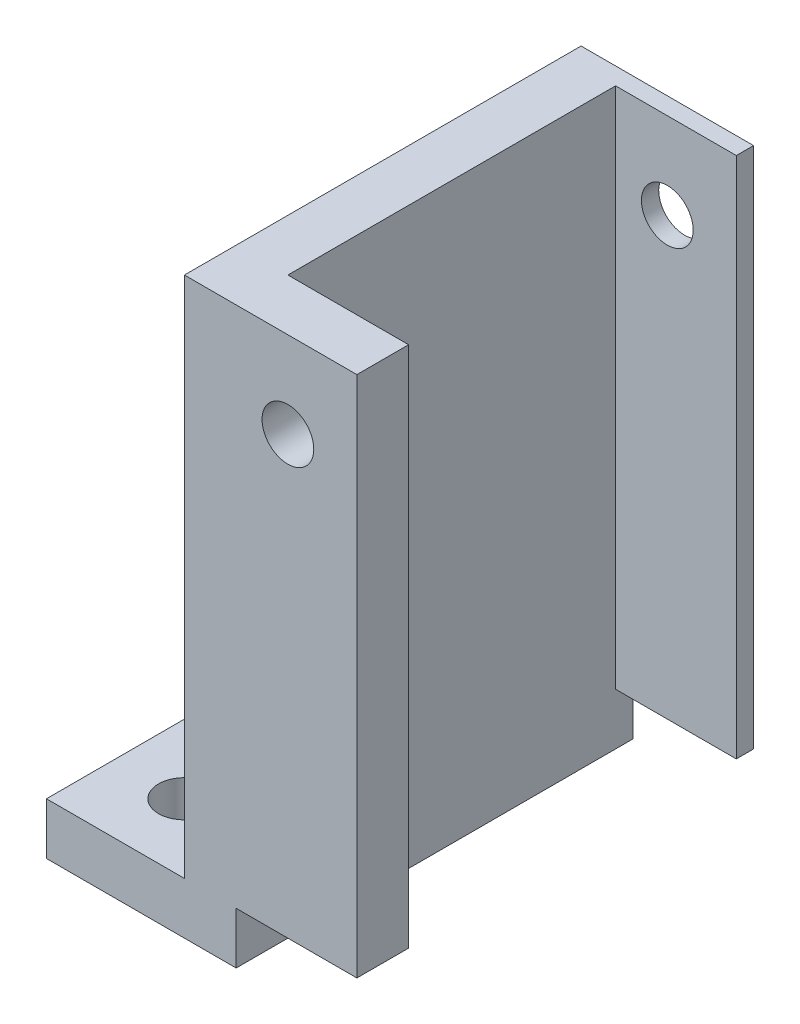
ISO-10303-21;
HEADER;
FILE_DESCRIPTION(('STEP AP214'),'2;1');
FILE_NAME('part.step','',(''),(''),'','','');
FILE_SCHEMA(('AUTOMOTIVE_DESIGN { 1 0 10303 214 1 1 1 1 }'));
ENDSEC;
DATA;
#1=APPLICATION_CONTEXT('core data for automotive mechanical design processes');
#2=APPLICATION_PROTOCOL_DEFINITION('international standard','automotive_design',2000,#1);
#3=PRODUCT_CONTEXT('',#1,'mechanical');
#4=PRODUCT('Part','Part','',(#3));
#5=PRODUCT_RELATED_PRODUCT_CATEGORY('part','',(#4));
#6=PRODUCT_DEFINITION_FORMATION('','',#4);
#7=PRODUCT_DEFINITION_CONTEXT('part definition',#1,'design');
#8=PRODUCT_DEFINITION('design','',#6,#7);
#9=PRODUCT_DEFINITION_SHAPE('','',#8);
#10=(LENGTH_UNIT() NAMED_UNIT(*) SI_UNIT(.MILLI.,.METRE.));
#11=(NAMED_UNIT(*) PLANE_ANGLE_UNIT() SI_UNIT($,.RADIAN.));
#12=(NAMED_UNIT(*) SI_UNIT($,.STERADIAN.) SOLID_ANGLE_UNIT());
#13=UNCERTAINTY_MEASURE_WITH_UNIT(LENGTH_MEASURE(1.E-05),#10,'distance_accuracy_value','');
#14=(GEOMETRIC_REPRESENTATION_CONTEXT(3) GLOBAL_UNCERTAINTY_ASSIGNED_CONTEXT((#13)) GLOBAL_UNIT_ASSIGNED_CONTEXT((#10,
#11,#12)) REPRESENTATION_CONTEXT('',''));
#15=CARTESIAN_POINT('',(0.,0.,0.));
#16=DIRECTION('',(0.,0.,1.));
#17=DIRECTION('',(1.,0.,0.));
#18=AXIS2_PLACEMENT_3D('',#15,#16,#17);
#19=CARTESIAN_POINT('',(10.,-30.3,23.));
#20=DIRECTION('',(0.,1.,0.));
#21=DIRECTION('',(0.,0.,1.));
#22=AXIS2_PLACEMENT_3D('',#19,#20,#21);
#23=PLANE('',#22);
#24=DIRECTION('',(0.,0.,1.));
#25=VECTOR('',#24,1.);
#26=CARTESIAN_POINT('',(3.,-30.3,23.));
#27=LINE('',#26,#25);
#28=CARTESIAN_POINT('',(3.,-30.3,0.));
#29=VERTEX_POINT('',#28);
#30=CARTESIAN_POINT('',(3.,-30.3,1.));
#31=VERTEX_POINT('',#30);
#32=EDGE_CURVE('E56',#29,#31,#27,.T.);
#33=ORIENTED_EDGE('',*,*,#32,.F.);
#34=DIRECTION('',(-1.,0.,0.));
#35=VECTOR('',#34,1.);
#36=CARTESIAN_POINT('',(10.,-30.3,0.));
#37=LINE('',#36,#35);
#38=CARTESIAN_POINT('',(10.,-30.3,0.));
#39=VERTEX_POINT('',#38);
#40=EDGE_CURVE('E225',#39,#29,#37,.T.);
#41=ORIENTED_EDGE('',*,*,#40,.F.);
#42=DIRECTION('',(0.,0.,-1.));
#43=VECTOR('',#42,1.);
#44=CARTESIAN_POINT('',(10.,-30.3,23.));
#45=LINE('',#44,#43);
#46=CARTESIAN_POINT('',(10.,-30.3,1.));
#47=VERTEX_POINT('',#46);
#48=EDGE_CURVE('E210',#47,#39,#45,.T.);
#49=ORIENTED_EDGE('',*,*,#48,.F.);
#50=DIRECTION('',(-1.,0.,0.));
#51=VECTOR('',#50,1.);
#52=CARTESIAN_POINT('',(10.,-30.3,1.));
#53=LINE('',#52,#51);
#54=EDGE_CURVE('E279',#47,#31,#53,.T.);
#55=ORIENTED_EDGE('',*,*,#54,.T.);
#56=EDGE_LOOP('',(#33,#41,#49,#55));
#57=FACE_BOUND('',#56,.T.);
#58=ADVANCED_FACE('F33',(#57),#23,.F.);
#59=CARTESIAN_POINT('',(3.,-30.3,20.));
#60=VERTEX_POINT('',#59);
#61=CARTESIAN_POINT('',(3.,-30.3,23.));
#62=VERTEX_POINT('',#61);
#63=EDGE_CURVE('E146',#60,#62,#27,.T.);
#64=ORIENTED_EDGE('',*,*,#63,.F.);
#65=DIRECTION('',(1.,0.,0.));
#66=VECTOR('',#65,1.);
#67=CARTESIAN_POINT('',(10.,-30.3,20.));
#68=LINE('',#67,#66);
#69=CARTESIAN_POINT('',(10.,-30.3,20.));
#70=VERTEX_POINT('',#69);
#71=EDGE_CURVE('E206',#60,#70,#68,.T.);
#72=ORIENTED_EDGE('',*,*,#71,.T.);
#73=CARTESIAN_POINT('',(10.,-30.3,23.));
#74=VERTEX_POINT('',#73);
#75=EDGE_CURVE('E211',#74,#70,#45,.T.);
#76=ORIENTED_EDGE('',*,*,#75,.F.);
#77=DIRECTION('',(-1.,0.,0.));
#78=VECTOR('',#77,1.);
#79=CARTESIAN_POINT('',(10.,-30.3,23.));
#80=LINE('',#79,#78);
#81=EDGE_CURVE('E234',#74,#62,#80,.T.);
#82=ORIENTED_EDGE('',*,*,#81,.T.);
#83=EDGE_LOOP('',(#64,#72,#76,#82));
#84=FACE_BOUND('',#83,.T.);
#85=ADVANCED_FACE('F292',(#84),#23,.F.);
#86=CARTESIAN_POINT('',(10.,0.,0.));
#87=DIRECTION('',(1.,0.,0.));
#88=DIRECTION('',(0.,0.,-1.));
#89=AXIS2_PLACEMENT_3D('',#86,#87,#88);
#90=PLANE('',#89);
#91=DIRECTION('',(0.,1.,0.));
#92=VECTOR('',#91,1.);
#93=CARTESIAN_POINT('',(10.,-30.3,20.));
#94=LINE('',#93,#92);
#95=CARTESIAN_POINT('',(10.,0.,20.));
#96=VERTEX_POINT('',#95);
#97=EDGE_CURVE('E186',#70,#96,#94,.T.);
#98=ORIENTED_EDGE('',*,*,#97,.T.);
#99=DIRECTION('',(0.,0.,1.));
#100=VECTOR('',#99,1.);
#101=CARTESIAN_POINT('',(10.,0.,23.));
#102=LINE('',#101,#100);
#103=CARTESIAN_POINT('',(10.,0.,23.));
#104=VERTEX_POINT('',#103);
#105=EDGE_CURVE('E213',#96,#104,#102,.T.);
#106=ORIENTED_EDGE('',*,*,#105,.T.);
#107=DIRECTION('',(0.,-1.,0.));
#108=VECTOR('',#107,1.);
#109=CARTESIAN_POINT('',(10.,0.,23.));
#110=LINE('',#109,#108);
#111=EDGE_CURVE('E207',#104,#74,#110,.T.);
#112=ORIENTED_EDGE('',*,*,#111,.T.);
#113=ORIENTED_EDGE('',*,*,#75,.T.);
#114=EDGE_LOOP('',(#98,#106,#112,#113));
#115=FACE_BOUND('',#114,.T.);
#116=ADVANCED_FACE('F295',(#115),#90,.T.);
#117=CARTESIAN_POINT('',(10.,0.,23.));
#118=DIRECTION('',(0.,0.,-1.));
#119=DIRECTION('',(0.,1.,0.));
#120=AXIS2_PLACEMENT_3D('',#117,#118,#119);
#121=PLANE('',#120);
#122=CARTESIAN_POINT('',(6.,-5.,23.));
#123=DIRECTION('',(0.,0.,1.));
#124=DIRECTION('',(1.,0.,0.));
#125=AXIS2_PLACEMENT_3D('',#122,#123,#124);
#126=CIRCLE('',#125,1.5);
#127=CARTESIAN_POINT('',(7.5,-5.,23.));
#128=VERTEX_POINT('',#127);
#129=EDGE_CURVE('E348',#128,#128,#126,.T.);
#130=ORIENTED_EDGE('',*,*,#129,.F.);
#131=EDGE_LOOP('',(#130));
#132=FACE_BOUND('',#131,.T.);
#133=DIRECTION('',(0.,-1.,0.));
#134=VECTOR('',#133,1.);
#135=CARTESIAN_POINT('',(0.,0.,23.));
#136=LINE('',#135,#134);
#137=CARTESIAN_POINT('',(0.,0.,23.));
#138=VERTEX_POINT('',#137);
#139=CARTESIAN_POINT('',(0.,-30.3,23.));
#140=VERTEX_POINT('',#139);
#141=EDGE_CURVE('E165',#138,#140,#136,.T.);
#142=ORIENTED_EDGE('',*,*,#141,.T.);
#143=DIRECTION('',(-1.,0.,0.));
#144=VECTOR('',#143,1.);
#145=CARTESIAN_POINT('',(3.,-30.3,23.));
#146=LINE('',#145,#144);
#147=CARTESIAN_POINT('',(-8.,-30.3,23.));
#148=VERTEX_POINT('',#147);
#149=EDGE_CURVE('E251',#140,#148,#146,.T.);
#150=ORIENTED_EDGE('',*,*,#149,.T.);
#151=DIRECTION('',(0.,1.,0.));
#152=VECTOR('',#151,1.);
#153=CARTESIAN_POINT('',(-8.,-33.3,23.));
#154=LINE('',#153,#152);
#155=CARTESIAN_POINT('',(-8.,-33.3,23.));
#156=VERTEX_POINT('',#155);
#157=EDGE_CURVE('E253',#156,#148,#154,.T.);
#158=ORIENTED_EDGE('',*,*,#157,.F.);
#159=DIRECTION('',(-1.,0.,0.));
#160=VECTOR('',#159,1.);
#161=CARTESIAN_POINT('',(3.,-33.3,23.));
#162=LINE('',#161,#160);
#163=CARTESIAN_POINT('',(3.,-33.3,23.));
#164=VERTEX_POINT('',#163);
#165=EDGE_CURVE('E373',#164,#156,#162,.T.);
#166=ORIENTED_EDGE('',*,*,#165,.F.);
#167=DIRECTION('',(0.,1.,0.));
#168=VECTOR('',#167,1.);
#169=CARTESIAN_POINT('',(3.,-33.3,23.));
#170=LINE('',#169,#168);
#171=EDGE_CURVE('E238',#164,#62,#170,.T.);
#172=ORIENTED_EDGE('',*,*,#171,.T.);
#173=ORIENTED_EDGE('',*,*,#81,.F.);
#174=ORIENTED_EDGE('',*,*,#111,.F.);
#175=DIRECTION('',(-1.,0.,0.));
#176=VECTOR('',#175,1.);
#177=CARTESIAN_POINT('',(10.,0.,23.));
#178=LINE('',#177,#176);
#179=EDGE_CURVE('E219',#104,#138,#178,.T.);
#180=ORIENTED_EDGE('',*,*,#179,.T.);
#181=EDGE_LOOP('',(#142,#150,#158,#166,#172,#173,#174,#180));
#182=FACE_BOUND('',#181,.T.);
#183=ADVANCED_FACE('F35',(#132,#182),#121,.F.);
#184=CARTESIAN_POINT('',(10.,0.,0.));
#185=DIRECTION('',(0.,0.,1.));
#186=DIRECTION('',(0.,-1.,0.));
#187=AXIS2_PLACEMENT_3D('',#184,#185,#186);
#188=PLANE('',#187);
#189=CARTESIAN_POINT('',(6.,-5.,0.));
#190=DIRECTION('',(0.,0.,1.));
#191=DIRECTION('',(0.,-1.,0.));
#192=AXIS2_PLACEMENT_3D('',#189,#190,#191);
#193=CIRCLE('',#192,1.5);
#194=CARTESIAN_POINT('',(6.,-6.5,0.));
#195=VERTEX_POINT('',#194);
#196=EDGE_CURVE('E358',#195,#195,#193,.T.);
#197=ORIENTED_EDGE('',*,*,#196,.T.);
#198=EDGE_LOOP('',(#197));
#199=FACE_BOUND('',#198,.T.);
#200=DIRECTION('',(0.,1.,0.));
#201=VECTOR('',#200,1.);
#202=CARTESIAN_POINT('',(0.,0.,0.));
#203=LINE('',#202,#201);
#204=CARTESIAN_POINT('',(0.,-30.3,0.));
#205=VERTEX_POINT('',#204);
#206=CARTESIAN_POINT('',(0.,0.,0.));
#207=VERTEX_POINT('',#206);
#208=EDGE_CURVE('E179',#205,#207,#203,.T.);
#209=ORIENTED_EDGE('',*,*,#208,.T.);
#210=DIRECTION('',(-1.,0.,0.));
#211=VECTOR('',#210,1.);
#212=CARTESIAN_POINT('',(10.,0.,0.));
#213=LINE('',#212,#211);
#214=CARTESIAN_POINT('',(10.,0.,0.));
#215=VERTEX_POINT('',#214);
#216=EDGE_CURVE('E222',#215,#207,#213,.T.);
#217=ORIENTED_EDGE('',*,*,#216,.F.);
#218=DIRECTION('',(0.,1.,0.));
#219=VECTOR('',#218,1.);
#220=CARTESIAN_POINT('',(10.,0.,0.));
#221=LINE('',#220,#219);
#222=EDGE_CURVE('E212',#39,#215,#221,.T.);
#223=ORIENTED_EDGE('',*,*,#222,.F.);
#224=ORIENTED_EDGE('',*,*,#40,.T.);
#225=DIRECTION('',(0.,1.,0.));
#226=VECTOR('',#225,1.);
#227=CARTESIAN_POINT('',(3.,-33.3,0.));
#228=LINE('',#227,#226);
#229=CARTESIAN_POINT('',(3.,-33.3,0.));
#230=VERTEX_POINT('',#229);
#231=EDGE_CURVE('E265',#230,#29,#228,.T.);
#232=ORIENTED_EDGE('',*,*,#231,.F.);
#233=DIRECTION('',(1.,0.,0.));
#234=VECTOR('',#233,1.);
#235=CARTESIAN_POINT('',(3.,-33.3,0.));
#236=LINE('',#235,#234);
#237=CARTESIAN_POINT('',(-8.,-33.3,0.));
#238=VERTEX_POINT('',#237);
#239=EDGE_CURVE('E243',#238,#230,#236,.T.);
#240=ORIENTED_EDGE('',*,*,#239,.F.);
#241=DIRECTION('',(0.,1.,0.));
#242=VECTOR('',#241,1.);
#243=CARTESIAN_POINT('',(-8.,-33.3,0.));
#244=LINE('',#243,#242);
#245=CARTESIAN_POINT('',(-8.,-30.3,0.));
#246=VERTEX_POINT('',#245);
#247=EDGE_CURVE('E263',#238,#246,#244,.T.);
#248=ORIENTED_EDGE('',*,*,#247,.T.);
#249=DIRECTION('',(1.,0.,0.));
#250=VECTOR('',#249,1.);
#251=CARTESIAN_POINT('',(3.,-30.3,0.));
#252=LINE('',#251,#250);
#253=EDGE_CURVE('E255',#246,#205,#252,.T.);
#254=ORIENTED_EDGE('',*,*,#253,.T.);
#255=EDGE_LOOP('',(#209,#217,#223,#224,#232,#240,#248,#254));
#256=FACE_BOUND('',#255,.T.);
#257=ADVANCED_FACE('F315',(#199,#256),#188,.F.);
#258=CARTESIAN_POINT('',(10.,0.,23.));
#259=DIRECTION('',(0.,-1.,0.));
#260=DIRECTION('',(0.,0.,-1.));
#261=AXIS2_PLACEMENT_3D('',#258,#259,#260);
#262=PLANE('',#261);
#263=ORIENTED_EDGE('',*,*,#105,.F.);
#264=DIRECTION('',(1.,0.,0.));
#265=VECTOR('',#264,1.);
#266=CARTESIAN_POINT('',(10.,0.,20.));
#267=LINE('',#266,#265);
#268=CARTESIAN_POINT('',(3.,0.,20.));
#269=VERTEX_POINT('',#268);
#270=EDGE_CURVE('E202',#269,#96,#267,.T.);
#271=ORIENTED_EDGE('',*,*,#270,.F.);
#272=DIRECTION('',(0.,0.,1.));
#273=VECTOR('',#272,1.);
#274=CARTESIAN_POINT('',(3.,0.,1.));
#275=LINE('',#274,#273);
#276=CARTESIAN_POINT('',(3.,0.,1.));
#277=VERTEX_POINT('',#276);
#278=EDGE_CURVE('E303',#277,#269,#275,.T.);
#279=ORIENTED_EDGE('',*,*,#278,.F.);
#280=DIRECTION('',(-1.,0.,0.));
#281=VECTOR('',#280,1.);
#282=CARTESIAN_POINT('',(10.,0.,1.));
#283=LINE('',#282,#281);
#284=CARTESIAN_POINT('',(10.,0.,1.));
#285=VERTEX_POINT('',#284);
#286=EDGE_CURVE('E307',#285,#277,#283,.T.);
#287=ORIENTED_EDGE('',*,*,#286,.F.);
#288=EDGE_CURVE('E171',#215,#285,#102,.T.);
#289=ORIENTED_EDGE('',*,*,#288,.F.);
#290=ORIENTED_EDGE('',*,*,#216,.T.);
#291=DIRECTION('',(0.,0.,1.));
#292=VECTOR('',#291,1.);
#293=CARTESIAN_POINT('',(0.,0.,23.));
#294=LINE('',#293,#292);
#295=EDGE_CURVE('E173',#207,#138,#294,.T.);
#296=ORIENTED_EDGE('',*,*,#295,.T.);
#297=ORIENTED_EDGE('',*,*,#179,.F.);
#298=EDGE_LOOP('',(#263,#271,#279,#287,#289,#290,#296,#297));
#299=FACE_BOUND('',#298,.T.);
#300=ADVANCED_FACE('F312',(#299),#262,.F.);
#301=DIRECTION('',(0.,1.,0.));
#302=VECTOR('',#301,1.);
#303=CARTESIAN_POINT('',(10.,-30.3,1.));
#304=LINE('',#303,#302);
#305=EDGE_CURVE('E204',#47,#285,#304,.T.);
#306=ORIENTED_EDGE('',*,*,#305,.F.);
#307=ORIENTED_EDGE('',*,*,#48,.T.);
#308=ORIENTED_EDGE('',*,*,#222,.T.);
#309=ORIENTED_EDGE('',*,*,#288,.T.);
#310=EDGE_LOOP('',(#306,#307,#308,#309));
#311=FACE_BOUND('',#310,.T.);
#312=ADVANCED_FACE('F314',(#311),#90,.T.);
#313=CARTESIAN_POINT('',(0.,0.,0.));
#314=DIRECTION('',(1.,0.,0.));
#315=DIRECTION('',(0.,0.,-1.));
#316=AXIS2_PLACEMENT_3D('',#313,#314,#315);
#317=PLANE('',#316);
#318=DIRECTION('',(0.,0.,-1.));
#319=VECTOR('',#318,1.);
#320=CARTESIAN_POINT('',(0.,-25.3502525316942,0.));
#321=LINE('',#320,#319);
#322=CARTESIAN_POINT('',(0.,-25.3502525316942,8.));
#323=VERTEX_POINT('',#322);
#324=CARTESIAN_POINT('',(0.,-25.3502525316942,15.));
#325=VERTEX_POINT('',#324);
#326=EDGE_CURVE('E153',#323,#325,#321,.F.);
#327=ORIENTED_EDGE('',*,*,#326,.T.);
#328=DIRECTION('',(0.,-1.,0.));
#329=VECTOR('',#328,1.);
#330=CARTESIAN_POINT('',(0.,0.,15.));
#331=LINE('',#330,#329);
#332=CARTESIAN_POINT('',(-2.30327909522821E-12,-30.3,15.));
#333=VERTEX_POINT('',#332);
#334=EDGE_CURVE('E347',#325,#333,#331,.T.);
#335=ORIENTED_EDGE('',*,*,#334,.T.);
#336=DIRECTION('',(0.,0.,-1.));
#337=VECTOR('',#336,1.);
#338=CARTESIAN_POINT('',(0.,-30.3,23.));
#339=LINE('',#338,#337);
#340=EDGE_CURVE('E164',#140,#333,#339,.T.);
#341=ORIENTED_EDGE('',*,*,#340,.F.);
#342=ORIENTED_EDGE('',*,*,#141,.F.);
#343=ORIENTED_EDGE('',*,*,#295,.F.);
#344=ORIENTED_EDGE('',*,*,#208,.F.);
#345=CARTESIAN_POINT('',(0.,-30.3,8.));
#346=VERTEX_POINT('',#345);
#347=EDGE_CURVE('E161',#346,#205,#339,.T.);
#348=ORIENTED_EDGE('',*,*,#347,.F.);
#349=DIRECTION('',(0.,-1.,0.));
#350=VECTOR('',#349,1.);
#351=CARTESIAN_POINT('',(0.,0.,8.));
#352=LINE('',#351,#350);
#353=EDGE_CURVE('E48',#323,#346,#352,.T.);
#354=ORIENTED_EDGE('',*,*,#353,.F.);
#355=EDGE_LOOP('',(#327,#335,#341,#342,#343,#344,#348,#354));
#356=FACE_BOUND('',#355,.T.);
#357=ADVANCED_FACE('F321',(#356),#317,.F.);
#358=CARTESIAN_POINT('',(10.,-30.3,20.));
#359=DIRECTION('',(0.,0.,1.));
#360=DIRECTION('',(1.,0.,0.));
#361=AXIS2_PLACEMENT_3D('',#358,#359,#360);
#362=PLANE('',#361);
#363=CARTESIAN_POINT('',(6.,-5.,20.));
#364=DIRECTION('',(0.,0.,1.));
#365=DIRECTION('',(1.,0.,0.));
#366=AXIS2_PLACEMENT_3D('',#363,#364,#365);
#367=CIRCLE('',#366,1.5);
#368=CARTESIAN_POINT('',(7.5,-5.,20.));
#369=VERTEX_POINT('',#368);
#370=EDGE_CURVE('E355',#369,#369,#367,.T.);
#371=ORIENTED_EDGE('',*,*,#370,.T.);
#372=EDGE_LOOP('',(#371));
#373=FACE_BOUND('',#372,.T.);
#374=ORIENTED_EDGE('',*,*,#270,.T.);
#375=ORIENTED_EDGE('',*,*,#97,.F.);
#376=ORIENTED_EDGE('',*,*,#71,.F.);
#377=DIRECTION('',(0.,1.,0.));
#378=VECTOR('',#377,1.);
#379=CARTESIAN_POINT('',(3.,-30.3,20.));
#380=LINE('',#379,#378);
#381=EDGE_CURVE('E193',#60,#269,#380,.T.);
#382=ORIENTED_EDGE('',*,*,#381,.T.);
#383=EDGE_LOOP('',(#374,#375,#376,#382));
#384=FACE_BOUND('',#383,.T.);
#385=ADVANCED_FACE('F305',(#373,#384),#362,.F.);
#386=CARTESIAN_POINT('',(3.,-30.3,1.));
#387=DIRECTION('',(-1.,0.,0.));
#388=DIRECTION('',(0.,0.,1.));
#389=AXIS2_PLACEMENT_3D('',#386,#387,#388);
#390=PLANE('',#389);
#391=ORIENTED_EDGE('',*,*,#171,.F.);
#392=DIRECTION('',(0.,0.,1.));
#393=VECTOR('',#392,1.);
#394=CARTESIAN_POINT('',(3.,-33.3,23.));
#395=LINE('',#394,#393);
#396=EDGE_CURVE('E259',#230,#164,#395,.T.);
#397=ORIENTED_EDGE('',*,*,#396,.F.);
#398=ORIENTED_EDGE('',*,*,#231,.T.);
#399=ORIENTED_EDGE('',*,*,#32,.T.);
#400=DIRECTION('',(0.,1.,0.));
#401=VECTOR('',#400,1.);
#402=CARTESIAN_POINT('',(3.,-30.3,1.));
#403=LINE('',#402,#401);
#404=EDGE_CURVE('E198',#31,#277,#403,.T.);
#405=ORIENTED_EDGE('',*,*,#404,.T.);
#406=ORIENTED_EDGE('',*,*,#278,.T.);
#407=ORIENTED_EDGE('',*,*,#381,.F.);
#408=ORIENTED_EDGE('',*,*,#63,.T.);
#409=EDGE_LOOP('',(#391,#397,#398,#399,#405,#406,#407,#408));
#410=FACE_BOUND('',#409,.T.);
#411=ADVANCED_FACE('F300',(#410),#390,.F.);
#412=CARTESIAN_POINT('',(10.,-30.3,1.));
#413=DIRECTION('',(0.,0.,-1.));
#414=DIRECTION('',(-1.,0.,0.));
#415=AXIS2_PLACEMENT_3D('',#412,#413,#414);
#416=PLANE('',#415);
#417=CARTESIAN_POINT('',(6.,-5.,1.));
#418=DIRECTION('',(0.,0.,-1.));
#419=DIRECTION('',(-1.,0.,0.));
#420=AXIS2_PLACEMENT_3D('',#417,#418,#419);
#421=CIRCLE('',#420,1.5);
#422=CARTESIAN_POINT('',(4.5,-5.,1.));
#423=VERTEX_POINT('',#422);
#424=EDGE_CURVE('E166',#423,#423,#421,.T.);
#425=ORIENTED_EDGE('',*,*,#424,.T.);
#426=EDGE_LOOP('',(#425));
#427=FACE_BOUND('',#426,.T.);
#428=ORIENTED_EDGE('',*,*,#286,.T.);
#429=ORIENTED_EDGE('',*,*,#404,.F.);
#430=ORIENTED_EDGE('',*,*,#54,.F.);
#431=ORIENTED_EDGE('',*,*,#305,.T.);
#432=EDGE_LOOP('',(#428,#429,#430,#431));
#433=FACE_BOUND('',#432,.T.);
#434=ADVANCED_FACE('F311',(#427,#433),#416,.F.);
#435=CARTESIAN_POINT('',(-8.,-33.3,23.));
#436=DIRECTION('',(1.,0.,0.));
#437=DIRECTION('',(0.,0.,-1.));
#438=AXIS2_PLACEMENT_3D('',#435,#436,#437);
#439=PLANE('',#438);
#440=DIRECTION('',(0.,0.,-1.));
#441=VECTOR('',#440,1.);
#442=CARTESIAN_POINT('',(-8.,-30.3,23.));
#443=LINE('',#442,#441);
#444=EDGE_CURVE('E260',#148,#246,#443,.T.);
#445=ORIENTED_EDGE('',*,*,#444,.T.);
#446=ORIENTED_EDGE('',*,*,#247,.F.);
#447=DIRECTION('',(0.,0.,-1.));
#448=VECTOR('',#447,1.);
#449=CARTESIAN_POINT('',(-8.,-33.3,23.));
#450=LINE('',#449,#448);
#451=EDGE_CURVE('E275',#156,#238,#450,.T.);
#452=ORIENTED_EDGE('',*,*,#451,.F.);
#453=ORIENTED_EDGE('',*,*,#157,.T.);
#454=EDGE_LOOP('',(#445,#446,#452,#453));
#455=FACE_BOUND('',#454,.T.);
#456=ADVANCED_FACE('F380',(#455),#439,.F.);
#457=CARTESIAN_POINT('',(0.,-33.3,0.));
#458=DIRECTION('',(0.,1.,0.));
#459=DIRECTION('',(0.,0.,1.));
#460=AXIS2_PLACEMENT_3D('',#457,#458,#459);
#461=PLANE('',#460);
#462=ORIENTED_EDGE('',*,*,#396,.T.);
#463=ORIENTED_EDGE('',*,*,#165,.T.);
#464=ORIENTED_EDGE('',*,*,#451,.T.);
#465=ORIENTED_EDGE('',*,*,#239,.T.);
#466=EDGE_LOOP('',(#462,#463,#464,#465));
#467=FACE_BOUND('',#466,.T.);
#468=CARTESIAN_POINT('',(-4.,-33.3,19.));
#469=DIRECTION('',(0.,1.,0.));
#470=DIRECTION('',(0.,0.,1.));
#471=AXIS2_PLACEMENT_3D('',#468,#469,#470);
#472=CIRCLE('',#471,1.5);
#473=CARTESIAN_POINT('',(-4.,-33.3,20.5));
#474=VERTEX_POINT('',#473);
#475=EDGE_CURVE('E364',#474,#474,#472,.T.);
#476=ORIENTED_EDGE('',*,*,#475,.T.);
#477=EDGE_LOOP('',(#476));
#478=FACE_BOUND('',#477,.T.);
#479=CARTESIAN_POINT('',(-4.,-33.3,3.99999999999999));
#480=DIRECTION('',(0.,1.,0.));
#481=DIRECTION('',(0.,0.,1.));
#482=AXIS2_PLACEMENT_3D('',#479,#480,#481);
#483=CIRCLE('',#482,1.5);
#484=CARTESIAN_POINT('',(-4.,-33.3,5.49999999999999));
#485=VERTEX_POINT('',#484);
#486=EDGE_CURVE('E252',#485,#485,#483,.T.);
#487=ORIENTED_EDGE('',*,*,#486,.T.);
#488=EDGE_LOOP('',(#487));
#489=FACE_BOUND('',#488,.T.);
#490=ADVANCED_FACE('F376',(#467,#478,#489),#461,.F.);
#491=CARTESIAN_POINT('',(0.,-30.3,0.));
#492=DIRECTION('',(0.,1.,0.));
#493=DIRECTION('',(0.,0.,1.));
#494=AXIS2_PLACEMENT_3D('',#491,#492,#493);
#495=PLANE('',#494);
#496=DIRECTION('',(1.,0.,0.));
#497=VECTOR('',#496,1.);
#498=CARTESIAN_POINT('',(0.,-30.3,15.));
#499=LINE('',#498,#497);
#500=CARTESIAN_POINT('',(-4.94974746830586,-30.3,15.));
#501=VERTEX_POINT('',#500);
#502=EDGE_CURVE('E11',#501,#333,#499,.T.);
#503=ORIENTED_EDGE('',*,*,#502,.F.);
#504=DIRECTION('',(0.,0.,-1.));
#505=VECTOR('',#504,1.);
#506=CARTESIAN_POINT('',(-4.94974746830586,-30.3,0.));
#507=LINE('',#506,#505);
#508=CARTESIAN_POINT('',(-4.94974746830586,-30.3,8.));
#509=VERTEX_POINT('',#508);
#510=EDGE_CURVE('E41',#509,#501,#507,.F.);
#511=ORIENTED_EDGE('',*,*,#510,.F.);
#512=DIRECTION('',(1.,0.,0.));
#513=VECTOR('',#512,1.);
#514=CARTESIAN_POINT('',(0.,-30.3,8.));
#515=LINE('',#514,#513);
#516=EDGE_CURVE('E139',#509,#346,#515,.T.);
#517=ORIENTED_EDGE('',*,*,#516,.T.);
#518=ORIENTED_EDGE('',*,*,#347,.T.);
#519=ORIENTED_EDGE('',*,*,#253,.F.);
#520=ORIENTED_EDGE('',*,*,#444,.F.);
#521=ORIENTED_EDGE('',*,*,#149,.F.);
#522=ORIENTED_EDGE('',*,*,#340,.T.);
#523=EDGE_LOOP('',(#503,#511,#517,#518,#519,#520,#521,#522));
#524=FACE_BOUND('',#523,.T.);
#525=CARTESIAN_POINT('',(-4.,-30.3,19.));
#526=DIRECTION('',(0.,1.,0.));
#527=DIRECTION('',(0.,0.,1.));
#528=AXIS2_PLACEMENT_3D('',#525,#526,#527);
#529=CIRCLE('',#528,1.5);
#530=CARTESIAN_POINT('',(-4.,-30.3,20.5));
#531=VERTEX_POINT('',#530);
#532=EDGE_CURVE('E361',#531,#531,#529,.T.);
#533=ORIENTED_EDGE('',*,*,#532,.F.);
#534=EDGE_LOOP('',(#533));
#535=FACE_BOUND('',#534,.T.);
#536=CARTESIAN_POINT('',(-4.,-30.3,3.99999999999999));
#537=DIRECTION('',(0.,1.,0.));
#538=DIRECTION('',(0.,0.,1.));
#539=AXIS2_PLACEMENT_3D('',#536,#537,#538);
#540=CIRCLE('',#539,1.5);
#541=CARTESIAN_POINT('',(-4.,-30.3,5.49999999999999));
#542=VERTEX_POINT('',#541);
#543=EDGE_CURVE('E367',#542,#542,#540,.T.);
#544=ORIENTED_EDGE('',*,*,#543,.F.);
#545=EDGE_LOOP('',(#544));
#546=FACE_BOUND('',#545,.T.);
#547=ADVANCED_FACE('F157',(#524,#535,#546),#495,.T.);
#548=CARTESIAN_POINT('',(-4.,-33.300025,3.99999999999999));
#549=DIRECTION('',(0.,1.,0.));
#550=DIRECTION('',(0.,0.,1.));
#551=AXIS2_PLACEMENT_3D('',#548,#549,#550);
#552=CYLINDRICAL_SURFACE('',#551,1.5);
#553=ORIENTED_EDGE('',*,*,#543,.T.);
#554=EDGE_LOOP('',(#553));
#555=FACE_BOUND('',#554,.T.);
#556=ORIENTED_EDGE('',*,*,#486,.F.);
#557=EDGE_LOOP('',(#556));
#558=FACE_BOUND('',#557,.T.);
#559=ADVANCED_FACE('F476',(#555,#558),#552,.F.);
#560=CARTESIAN_POINT('',(-4.,-33.300025,19.));
#561=DIRECTION('',(0.,1.,0.));
#562=DIRECTION('',(0.,0.,1.));
#563=AXIS2_PLACEMENT_3D('',#560,#561,#562);
#564=CYLINDRICAL_SURFACE('',#563,1.5);
#565=ORIENTED_EDGE('',*,*,#532,.T.);
#566=EDGE_LOOP('',(#565));
#567=FACE_BOUND('',#566,.T.);
#568=ORIENTED_EDGE('',*,*,#475,.F.);
#569=EDGE_LOOP('',(#568));
#570=FACE_BOUND('',#569,.T.);
#571=ADVANCED_FACE('F420',(#567,#570),#564,.F.);
#572=CARTESIAN_POINT('',(6.,-5.,-5.00000000049072E-05));
#573=DIRECTION('',(0.,0.,1.));
#574=DIRECTION('',(1.,0.,0.));
#575=AXIS2_PLACEMENT_3D('',#572,#573,#574);
#576=CYLINDRICAL_SURFACE('',#575,1.5);
#577=ORIENTED_EDGE('',*,*,#424,.F.);
#578=EDGE_LOOP('',(#577));
#579=FACE_BOUND('',#578,.T.);
#580=ORIENTED_EDGE('',*,*,#196,.F.);
#581=EDGE_LOOP('',(#580));
#582=FACE_BOUND('',#581,.T.);
#583=ADVANCED_FACE('F414',(#579,#582),#576,.F.);
#584=ORIENTED_EDGE('',*,*,#129,.T.);
#585=EDGE_LOOP('',(#584));
#586=FACE_BOUND('',#585,.T.);
#587=ORIENTED_EDGE('',*,*,#370,.F.);
#588=EDGE_LOOP('',(#587));
#589=FACE_BOUND('',#588,.T.);
#590=ADVANCED_FACE('F419',(#586,#589),#576,.F.);
#591=CARTESIAN_POINT('',(-4.94974746830586,-30.3,11.5));
#592=DIRECTION('',(0.707106781186544,-0.707106781186551,0.));
#593=DIRECTION('',(0.707106781186551,0.707106781186544,0.));
#594=AXIS2_PLACEMENT_3D('',#591,#592,#593);
#595=PLANE('',#594);
#596=ORIENTED_EDGE('',*,*,#326,.F.);
#597=DIRECTION('',(0.707106781186551,0.707106781186544,0.));
#598=VECTOR('',#597,1.);
#599=CARTESIAN_POINT('',(-4.94974746830586,-30.3,8.));
#600=LINE('',#599,#598);
#601=EDGE_CURVE('E142',#509,#323,#600,.T.);
#602=ORIENTED_EDGE('',*,*,#601,.F.);
#603=ORIENTED_EDGE('',*,*,#510,.T.);
#604=DIRECTION('',(0.707106781186551,0.707106781186544,0.));
#605=VECTOR('',#604,1.);
#606=CARTESIAN_POINT('',(-4.94974746830586,-30.3,15.));
#607=LINE('',#606,#605);
#608=EDGE_CURVE('E154',#501,#325,#607,.T.);
#609=ORIENTED_EDGE('',*,*,#608,.T.);
#610=EDGE_LOOP('',(#596,#602,#603,#609));
#611=FACE_BOUND('',#610,.T.);
#612=ADVANCED_FACE('F149',(#611),#595,.F.);
#613=CARTESIAN_POINT('',(1.,-16.65,15.));
#614=DIRECTION('',(0.,0.,1.));
#615=DIRECTION('',(1.,0.,0.));
#616=AXIS2_PLACEMENT_3D('',#613,#614,#615);
#617=PLANE('',#616);
#618=ORIENTED_EDGE('',*,*,#502,.T.);
#619=ORIENTED_EDGE('',*,*,#334,.F.);
#620=ORIENTED_EDGE('',*,*,#608,.F.);
#621=EDGE_LOOP('',(#618,#619,#620));
#622=FACE_BOUND('',#621,.T.);
#623=ADVANCED_FACE('F522',(#622),#617,.T.);
#624=CARTESIAN_POINT('',(1.,-16.65,8.));
#625=DIRECTION('',(0.,0.,1.));
#626=DIRECTION('',(1.,0.,0.));
#627=AXIS2_PLACEMENT_3D('',#624,#625,#626);
#628=PLANE('',#627);
#629=ORIENTED_EDGE('',*,*,#601,.T.);
#630=ORIENTED_EDGE('',*,*,#353,.T.);
#631=ORIENTED_EDGE('',*,*,#516,.F.);
#632=EDGE_LOOP('',(#629,#630,#631));
#633=FACE_BOUND('',#632,.T.);
#634=ADVANCED_FACE('F141',(#633),#628,.F.);
#635=CLOSED_SHELL('',(#58,#85,#116,#183,#257,#300,#312,#357,#385,#411,#434,#456,#490,#547,#559,
#571,#583,#590,#612,#623,#634));
#636=MANIFOLD_SOLID_BREP('B2',#635);
#637=ADVANCED_BREP_SHAPE_REPRESENTATION('',(#18,#636),#14);
#638=SHAPE_DEFINITION_REPRESENTATION(#9,#637);
ENDSEC;
END-ISO-10303-21;
